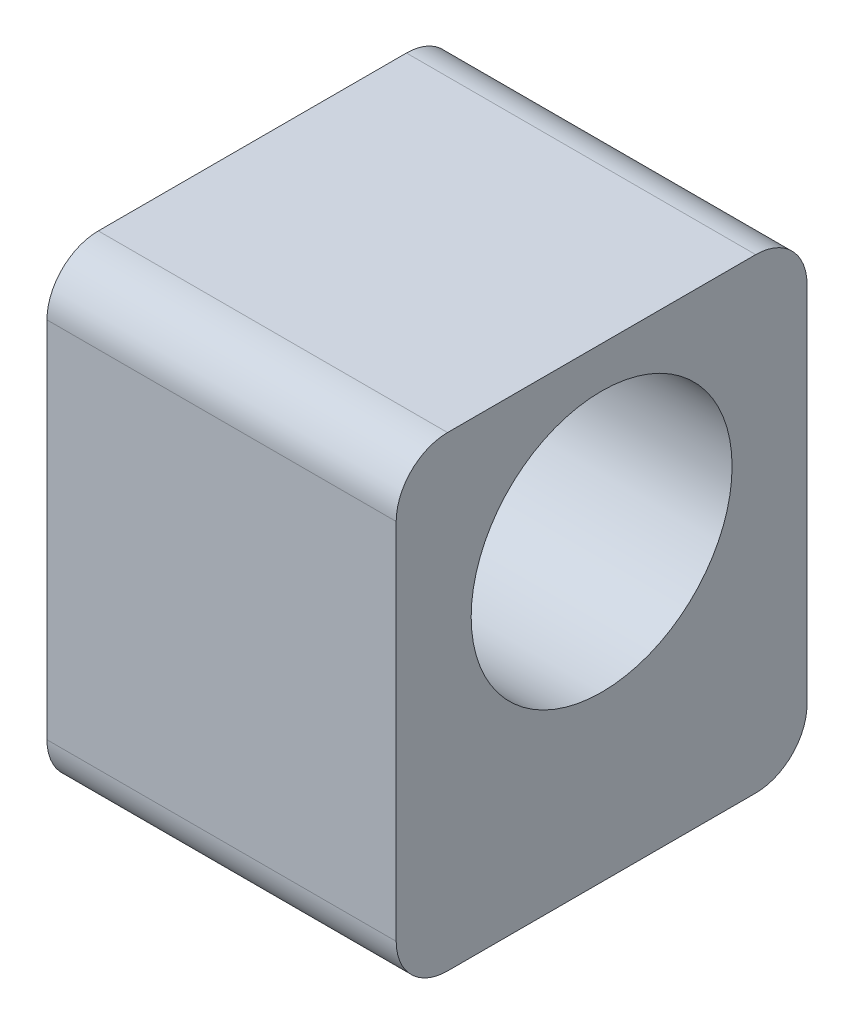
ISO-10303-21;
HEADER;
FILE_DESCRIPTION(('STEP AP214'),'2;1');
FILE_NAME('part.step','',(''),(''),'','','');
FILE_SCHEMA(('AUTOMOTIVE_DESIGN { 1 0 10303 214 1 1 1 1 }'));
ENDSEC;
DATA;
#1=APPLICATION_CONTEXT('core data for automotive mechanical design processes');
#2=APPLICATION_PROTOCOL_DEFINITION('international standard','automotive_design',2000,#1);
#3=PRODUCT_CONTEXT('',#1,'mechanical');
#4=PRODUCT('Part','Part','',(#3));
#5=PRODUCT_RELATED_PRODUCT_CATEGORY('part','',(#4));
#6=PRODUCT_DEFINITION_FORMATION('','',#4);
#7=PRODUCT_DEFINITION_CONTEXT('part definition',#1,'design');
#8=PRODUCT_DEFINITION('design','',#6,#7);
#9=PRODUCT_DEFINITION_SHAPE('','',#8);
#10=(LENGTH_UNIT() NAMED_UNIT(*) SI_UNIT(.MILLI.,.METRE.));
#11=(NAMED_UNIT(*) PLANE_ANGLE_UNIT() SI_UNIT($,.RADIAN.));
#12=(NAMED_UNIT(*) SI_UNIT($,.STERADIAN.) SOLID_ANGLE_UNIT());
#13=UNCERTAINTY_MEASURE_WITH_UNIT(LENGTH_MEASURE(1.E-05),#10,'distance_accuracy_value','');
#14=(GEOMETRIC_REPRESENTATION_CONTEXT(3) GLOBAL_UNCERTAINTY_ASSIGNED_CONTEXT((#13)) GLOBAL_UNIT_ASSIGNED_CONTEXT((#10,
#11,#12)) REPRESENTATION_CONTEXT('',''));
#15=CARTESIAN_POINT('',(0.,0.,0.));
#16=DIRECTION('',(0.,0.,1.));
#17=DIRECTION('',(1.,0.,0.));
#18=AXIS2_PLACEMENT_3D('',#15,#16,#17);
#19=CARTESIAN_POINT('',(17.,-23.7,15.));
#20=DIRECTION('',(1.,0.,0.));
#21=DIRECTION('',(0.,0.,-1.));
#22=AXIS2_PLACEMENT_3D('',#19,#20,#21);
#23=PLANE('',#22);
#24=CARTESIAN_POINT('',(17.,-23.7,15.));
#25=DIRECTION('',(1.,0.,0.));
#26=DIRECTION('',(0.,0.,-1.));
#27=AXIS2_PLACEMENT_3D('',#24,#25,#26);
#28=CIRCLE('',#27,5.);
#29=CARTESIAN_POINT('',(17.,-23.7,20.));
#30=VERTEX_POINT('',#29);
#31=CARTESIAN_POINT('',(17.,-28.7,15.));
#32=VERTEX_POINT('',#31);
#33=EDGE_CURVE('E151',#30,#32,#28,.T.);
#34=ORIENTED_EDGE('',*,*,#33,.T.);
#35=DIRECTION('',(0.,0.,-1.));
#36=VECTOR('',#35,1.);
#37=CARTESIAN_POINT('',(17.,-28.7,15.));
#38=LINE('',#37,#36);
#39=CARTESIAN_POINT('',(17.,-28.7,-15.));
#40=VERTEX_POINT('',#39);
#41=EDGE_CURVE('E99',#32,#40,#38,.T.);
#42=ORIENTED_EDGE('',*,*,#41,.T.);
#43=CARTESIAN_POINT('',(17.,-23.7,-15.));
#44=DIRECTION('',(1.,0.,0.));
#45=DIRECTION('',(0.,0.,-1.));
#46=AXIS2_PLACEMENT_3D('',#43,#44,#45);
#47=CIRCLE('',#46,5.);
#48=CARTESIAN_POINT('',(17.,-23.7,-20.));
#49=VERTEX_POINT('',#48);
#50=EDGE_CURVE('E166',#40,#49,#47,.T.);
#51=ORIENTED_EDGE('',*,*,#50,.T.);
#52=DIRECTION('',(0.,1.,0.));
#53=VECTOR('',#52,1.);
#54=CARTESIAN_POINT('',(17.,-23.7,-20.));
#55=LINE('',#54,#53);
#56=CARTESIAN_POINT('',(17.,11.7,-20.));
#57=VERTEX_POINT('',#56);
#58=EDGE_CURVE('E179',#49,#57,#55,.T.);
#59=ORIENTED_EDGE('',*,*,#58,.T.);
#60=CARTESIAN_POINT('',(17.,11.7,-15.));
#61=DIRECTION('',(1.,0.,0.));
#62=DIRECTION('',(0.,0.,-1.));
#63=AXIS2_PLACEMENT_3D('',#60,#61,#62);
#64=CIRCLE('',#63,5.);
#65=CARTESIAN_POINT('',(17.,16.7,-15.));
#66=VERTEX_POINT('',#65);
#67=EDGE_CURVE('E118',#57,#66,#64,.T.);
#68=ORIENTED_EDGE('',*,*,#67,.T.);
#69=DIRECTION('',(0.,0.,1.));
#70=VECTOR('',#69,1.);
#71=CARTESIAN_POINT('',(17.,16.7,-15.));
#72=LINE('',#71,#70);
#73=CARTESIAN_POINT('',(17.,16.7,15.));
#74=VERTEX_POINT('',#73);
#75=EDGE_CURVE('E112',#66,#74,#72,.T.);
#76=ORIENTED_EDGE('',*,*,#75,.T.);
#77=CARTESIAN_POINT('',(17.,11.7,15.));
#78=DIRECTION('',(1.,0.,0.));
#79=DIRECTION('',(0.,0.,-1.));
#80=AXIS2_PLACEMENT_3D('',#77,#78,#79);
#81=CIRCLE('',#80,5.);
#82=CARTESIAN_POINT('',(17.,11.7,20.));
#83=VERTEX_POINT('',#82);
#84=EDGE_CURVE('E116',#74,#83,#81,.T.);
#85=ORIENTED_EDGE('',*,*,#84,.T.);
#86=DIRECTION('',(0.,-1.,0.));
#87=VECTOR('',#86,1.);
#88=CARTESIAN_POINT('',(17.,11.7,20.));
#89=LINE('',#88,#87);
#90=EDGE_CURVE('E56',#83,#30,#89,.T.);
#91=ORIENTED_EDGE('',*,*,#90,.T.);
#92=EDGE_LOOP('',(#34,#42,#51,#59,#68,#76,#85,#91));
#93=FACE_BOUND('',#92,.T.);
#94=CARTESIAN_POINT('',(17.,0.,0.));
#95=DIRECTION('',(1.,0.,0.));
#96=DIRECTION('',(0.,0.,-1.));
#97=AXIS2_PLACEMENT_3D('',#94,#95,#96);
#98=CIRCLE('',#97,12.7);
#99=CARTESIAN_POINT('',(17.,0.,-12.7));
#100=VERTEX_POINT('',#99);
#101=EDGE_CURVE('E140',#100,#100,#98,.T.);
#102=ORIENTED_EDGE('',*,*,#101,.F.);
#103=EDGE_LOOP('',(#102));
#104=FACE_BOUND('',#103,.T.);
#105=ADVANCED_FACE('F39',(#93,#104),#23,.T.);
#106=CARTESIAN_POINT('',(-17.,-23.7,15.));
#107=DIRECTION('',(1.,0.,0.));
#108=DIRECTION('',(0.,0.,-1.));
#109=AXIS2_PLACEMENT_3D('',#106,#107,#108);
#110=PLANE('',#109);
#111=CARTESIAN_POINT('',(-17.,-23.7,15.));
#112=DIRECTION('',(1.,0.,0.));
#113=DIRECTION('',(0.,0.,-1.));
#114=AXIS2_PLACEMENT_3D('',#111,#112,#113);
#115=CIRCLE('',#114,5.);
#116=CARTESIAN_POINT('',(-17.,-23.7,20.));
#117=VERTEX_POINT('',#116);
#118=CARTESIAN_POINT('',(-17.,-28.7,15.));
#119=VERTEX_POINT('',#118);
#120=EDGE_CURVE('E136',#117,#119,#115,.T.);
#121=ORIENTED_EDGE('',*,*,#120,.F.);
#122=DIRECTION('',(0.,-1.,0.));
#123=VECTOR('',#122,1.);
#124=CARTESIAN_POINT('',(-17.,11.7,20.));
#125=LINE('',#124,#123);
#126=CARTESIAN_POINT('',(-17.,11.7,20.));
#127=VERTEX_POINT('',#126);
#128=EDGE_CURVE('E91',#127,#117,#125,.T.);
#129=ORIENTED_EDGE('',*,*,#128,.F.);
#130=CARTESIAN_POINT('',(-17.,11.7,15.));
#131=DIRECTION('',(1.,0.,0.));
#132=DIRECTION('',(0.,0.,-1.));
#133=AXIS2_PLACEMENT_3D('',#130,#131,#132);
#134=CIRCLE('',#133,5.);
#135=CARTESIAN_POINT('',(-17.,16.7,15.));
#136=VERTEX_POINT('',#135);
#137=EDGE_CURVE('E85',#136,#127,#134,.T.);
#138=ORIENTED_EDGE('',*,*,#137,.F.);
#139=DIRECTION('',(0.,0.,1.));
#140=VECTOR('',#139,1.);
#141=CARTESIAN_POINT('',(-17.,16.7,-15.));
#142=LINE('',#141,#140);
#143=CARTESIAN_POINT('',(-17.,16.7,-15.));
#144=VERTEX_POINT('',#143);
#145=EDGE_CURVE('E126',#144,#136,#142,.T.);
#146=ORIENTED_EDGE('',*,*,#145,.F.);
#147=CARTESIAN_POINT('',(-17.,11.7,-15.));
#148=DIRECTION('',(1.,0.,0.));
#149=DIRECTION('',(0.,0.,-1.));
#150=AXIS2_PLACEMENT_3D('',#147,#148,#149);
#151=CIRCLE('',#150,5.);
#152=CARTESIAN_POINT('',(-17.,11.7,-20.));
#153=VERTEX_POINT('',#152);
#154=EDGE_CURVE('E146',#153,#144,#151,.T.);
#155=ORIENTED_EDGE('',*,*,#154,.F.);
#156=DIRECTION('',(0.,1.,0.));
#157=VECTOR('',#156,1.);
#158=CARTESIAN_POINT('',(-17.,-23.7,-20.));
#159=LINE('',#158,#157);
#160=CARTESIAN_POINT('',(-17.,-23.7,-20.));
#161=VERTEX_POINT('',#160);
#162=EDGE_CURVE('E144',#161,#153,#159,.T.);
#163=ORIENTED_EDGE('',*,*,#162,.F.);
#164=CARTESIAN_POINT('',(-17.,-23.7,-15.));
#165=DIRECTION('',(1.,0.,0.));
#166=DIRECTION('',(0.,0.,-1.));
#167=AXIS2_PLACEMENT_3D('',#164,#165,#166);
#168=CIRCLE('',#167,5.);
#169=CARTESIAN_POINT('',(-17.,-28.7,-15.));
#170=VERTEX_POINT('',#169);
#171=EDGE_CURVE('E142',#170,#161,#168,.T.);
#172=ORIENTED_EDGE('',*,*,#171,.F.);
#173=DIRECTION('',(0.,0.,-1.));
#174=VECTOR('',#173,1.);
#175=CARTESIAN_POINT('',(-17.,-28.7,15.));
#176=LINE('',#175,#174);
#177=EDGE_CURVE('E139',#119,#170,#176,.T.);
#178=ORIENTED_EDGE('',*,*,#177,.F.);
#179=EDGE_LOOP('',(#121,#129,#138,#146,#155,#163,#172,#178));
#180=FACE_BOUND('',#179,.T.);
#181=CARTESIAN_POINT('',(-17.,0.,0.));
#182=DIRECTION('',(1.,0.,0.));
#183=DIRECTION('',(0.,0.,-1.));
#184=AXIS2_PLACEMENT_3D('',#181,#182,#183);
#185=CIRCLE('',#184,12.7);
#186=CARTESIAN_POINT('',(-17.,0.,-12.7));
#187=VERTEX_POINT('',#186);
#188=EDGE_CURVE('E185',#187,#187,#185,.T.);
#189=ORIENTED_EDGE('',*,*,#188,.T.);
#190=EDGE_LOOP('',(#189));
#191=FACE_BOUND('',#190,.T.);
#192=ADVANCED_FACE('F170',(#180,#191),#110,.F.);
#193=CARTESIAN_POINT('',(17.,-23.7,15.));
#194=DIRECTION('',(-1.,0.,0.));
#195=DIRECTION('',(0.,0.,1.));
#196=AXIS2_PLACEMENT_3D('',#193,#194,#195);
#197=CYLINDRICAL_SURFACE('',#196,5.);
#198=ORIENTED_EDGE('',*,*,#120,.T.);
#199=DIRECTION('',(-1.,0.,0.));
#200=VECTOR('',#199,1.);
#201=CARTESIAN_POINT('',(17.,-28.7,15.));
#202=LINE('',#201,#200);
#203=EDGE_CURVE('E11',#32,#119,#202,.T.);
#204=ORIENTED_EDGE('',*,*,#203,.F.);
#205=ORIENTED_EDGE('',*,*,#33,.F.);
#206=DIRECTION('',(-1.,0.,0.));
#207=VECTOR('',#206,1.);
#208=CARTESIAN_POINT('',(17.,-23.7,20.));
#209=LINE('',#208,#207);
#210=EDGE_CURVE('E132',#30,#117,#209,.T.);
#211=ORIENTED_EDGE('',*,*,#210,.T.);
#212=EDGE_LOOP('',(#198,#204,#205,#211));
#213=FACE_BOUND('',#212,.T.);
#214=ADVANCED_FACE('F41',(#213),#197,.T.);
#215=CARTESIAN_POINT('',(17.,-28.7,15.));
#216=DIRECTION('',(0.,1.,0.));
#217=DIRECTION('',(0.,0.,1.));
#218=AXIS2_PLACEMENT_3D('',#215,#216,#217);
#219=PLANE('',#218);
#220=ORIENTED_EDGE('',*,*,#177,.T.);
#221=DIRECTION('',(-1.,0.,0.));
#222=VECTOR('',#221,1.);
#223=CARTESIAN_POINT('',(17.,-28.7,-15.));
#224=LINE('',#223,#222);
#225=EDGE_CURVE('E48',#40,#170,#224,.T.);
#226=ORIENTED_EDGE('',*,*,#225,.F.);
#227=ORIENTED_EDGE('',*,*,#41,.F.);
#228=ORIENTED_EDGE('',*,*,#203,.T.);
#229=EDGE_LOOP('',(#220,#226,#227,#228));
#230=FACE_BOUND('',#229,.T.);
#231=ADVANCED_FACE('F213',(#230),#219,.F.);
#232=CARTESIAN_POINT('',(17.,-23.7,-15.));
#233=DIRECTION('',(-1.,0.,0.));
#234=DIRECTION('',(0.,0.,1.));
#235=AXIS2_PLACEMENT_3D('',#232,#233,#234);
#236=CYLINDRICAL_SURFACE('',#235,5.);
#237=ORIENTED_EDGE('',*,*,#171,.T.);
#238=DIRECTION('',(-1.,0.,0.));
#239=VECTOR('',#238,1.);
#240=CARTESIAN_POINT('',(17.,-23.7,-20.));
#241=LINE('',#240,#239);
#242=EDGE_CURVE('E158',#49,#161,#241,.T.);
#243=ORIENTED_EDGE('',*,*,#242,.F.);
#244=ORIENTED_EDGE('',*,*,#50,.F.);
#245=ORIENTED_EDGE('',*,*,#225,.T.);
#246=EDGE_LOOP('',(#237,#243,#244,#245));
#247=FACE_BOUND('',#246,.T.);
#248=ADVANCED_FACE('F164',(#247),#236,.T.);
#249=CARTESIAN_POINT('',(17.,-23.7,-20.));
#250=DIRECTION('',(0.,0.,1.));
#251=DIRECTION('',(1.,0.,0.));
#252=AXIS2_PLACEMENT_3D('',#249,#250,#251);
#253=PLANE('',#252);
#254=ORIENTED_EDGE('',*,*,#162,.T.);
#255=DIRECTION('',(-1.,0.,0.));
#256=VECTOR('',#255,1.);
#257=CARTESIAN_POINT('',(17.,11.7,-20.));
#258=LINE('',#257,#256);
#259=EDGE_CURVE('E155',#57,#153,#258,.T.);
#260=ORIENTED_EDGE('',*,*,#259,.F.);
#261=ORIENTED_EDGE('',*,*,#58,.F.);
#262=ORIENTED_EDGE('',*,*,#242,.T.);
#263=EDGE_LOOP('',(#254,#260,#261,#262));
#264=FACE_BOUND('',#263,.T.);
#265=ADVANCED_FACE('F175',(#264),#253,.F.);
#266=CARTESIAN_POINT('',(17.,11.7,-15.));
#267=DIRECTION('',(-1.,0.,0.));
#268=DIRECTION('',(0.,0.,1.));
#269=AXIS2_PLACEMENT_3D('',#266,#267,#268);
#270=CYLINDRICAL_SURFACE('',#269,5.);
#271=ORIENTED_EDGE('',*,*,#154,.T.);
#272=DIRECTION('',(-1.,0.,0.));
#273=VECTOR('',#272,1.);
#274=CARTESIAN_POINT('',(17.,16.7,-15.));
#275=LINE('',#274,#273);
#276=EDGE_CURVE('E127',#66,#144,#275,.T.);
#277=ORIENTED_EDGE('',*,*,#276,.F.);
#278=ORIENTED_EDGE('',*,*,#67,.F.);
#279=ORIENTED_EDGE('',*,*,#259,.T.);
#280=EDGE_LOOP('',(#271,#277,#278,#279));
#281=FACE_BOUND('',#280,.T.);
#282=ADVANCED_FACE('F178',(#281),#270,.T.);
#283=CARTESIAN_POINT('',(17.,16.7,-15.));
#284=DIRECTION('',(0.,-1.,0.));
#285=DIRECTION('',(0.,0.,-1.));
#286=AXIS2_PLACEMENT_3D('',#283,#284,#285);
#287=PLANE('',#286);
#288=ORIENTED_EDGE('',*,*,#145,.T.);
#289=DIRECTION('',(-1.,0.,0.));
#290=VECTOR('',#289,1.);
#291=CARTESIAN_POINT('',(17.,16.7,15.));
#292=LINE('',#291,#290);
#293=EDGE_CURVE('E123',#74,#136,#292,.T.);
#294=ORIENTED_EDGE('',*,*,#293,.F.);
#295=ORIENTED_EDGE('',*,*,#75,.F.);
#296=ORIENTED_EDGE('',*,*,#276,.T.);
#297=EDGE_LOOP('',(#288,#294,#295,#296));
#298=FACE_BOUND('',#297,.T.);
#299=ADVANCED_FACE('F124',(#298),#287,.F.);
#300=CARTESIAN_POINT('',(17.,11.7,15.));
#301=DIRECTION('',(-1.,0.,0.));
#302=DIRECTION('',(0.,0.,1.));
#303=AXIS2_PLACEMENT_3D('',#300,#301,#302);
#304=CYLINDRICAL_SURFACE('',#303,5.);
#305=ORIENTED_EDGE('',*,*,#137,.T.);
#306=DIRECTION('',(-1.,0.,0.));
#307=VECTOR('',#306,1.);
#308=CARTESIAN_POINT('',(17.,11.7,20.));
#309=LINE('',#308,#307);
#310=EDGE_CURVE('E128',#83,#127,#309,.T.);
#311=ORIENTED_EDGE('',*,*,#310,.F.);
#312=ORIENTED_EDGE('',*,*,#84,.F.);
#313=ORIENTED_EDGE('',*,*,#293,.T.);
#314=EDGE_LOOP('',(#305,#311,#312,#313));
#315=FACE_BOUND('',#314,.T.);
#316=ADVANCED_FACE('F130',(#315),#304,.T.);
#317=CARTESIAN_POINT('',(17.,11.7,20.));
#318=DIRECTION('',(0.,0.,-1.));
#319=DIRECTION('',(-1.,0.,0.));
#320=AXIS2_PLACEMENT_3D('',#317,#318,#319);
#321=PLANE('',#320);
#322=ORIENTED_EDGE('',*,*,#128,.T.);
#323=ORIENTED_EDGE('',*,*,#210,.F.);
#324=ORIENTED_EDGE('',*,*,#90,.F.);
#325=ORIENTED_EDGE('',*,*,#310,.T.);
#326=EDGE_LOOP('',(#322,#323,#324,#325));
#327=FACE_BOUND('',#326,.T.);
#328=ADVANCED_FACE('F201',(#327),#321,.F.);
#329=CARTESIAN_POINT('',(17.,0.,0.));
#330=DIRECTION('',(-1.,0.,0.));
#331=DIRECTION('',(0.,0.,1.));
#332=AXIS2_PLACEMENT_3D('',#329,#330,#331);
#333=CYLINDRICAL_SURFACE('',#332,12.7);
#334=ORIENTED_EDGE('',*,*,#101,.T.);
#335=EDGE_LOOP('',(#334));
#336=FACE_BOUND('',#335,.T.);
#337=ORIENTED_EDGE('',*,*,#188,.F.);
#338=EDGE_LOOP('',(#337));
#339=FACE_BOUND('',#338,.T.);
#340=ADVANCED_FACE('F191',(#336,#339),#333,.F.);
#341=CLOSED_SHELL('',(#105,#192,#214,#231,#248,#265,#282,#299,#316,#328,#340));
#342=MANIFOLD_SOLID_BREP('B2',#341);
#343=ADVANCED_BREP_SHAPE_REPRESENTATION('',(#18,#342),#14);
#344=SHAPE_DEFINITION_REPRESENTATION(#9,#343);
ENDSEC;
END-ISO-10303-21;
